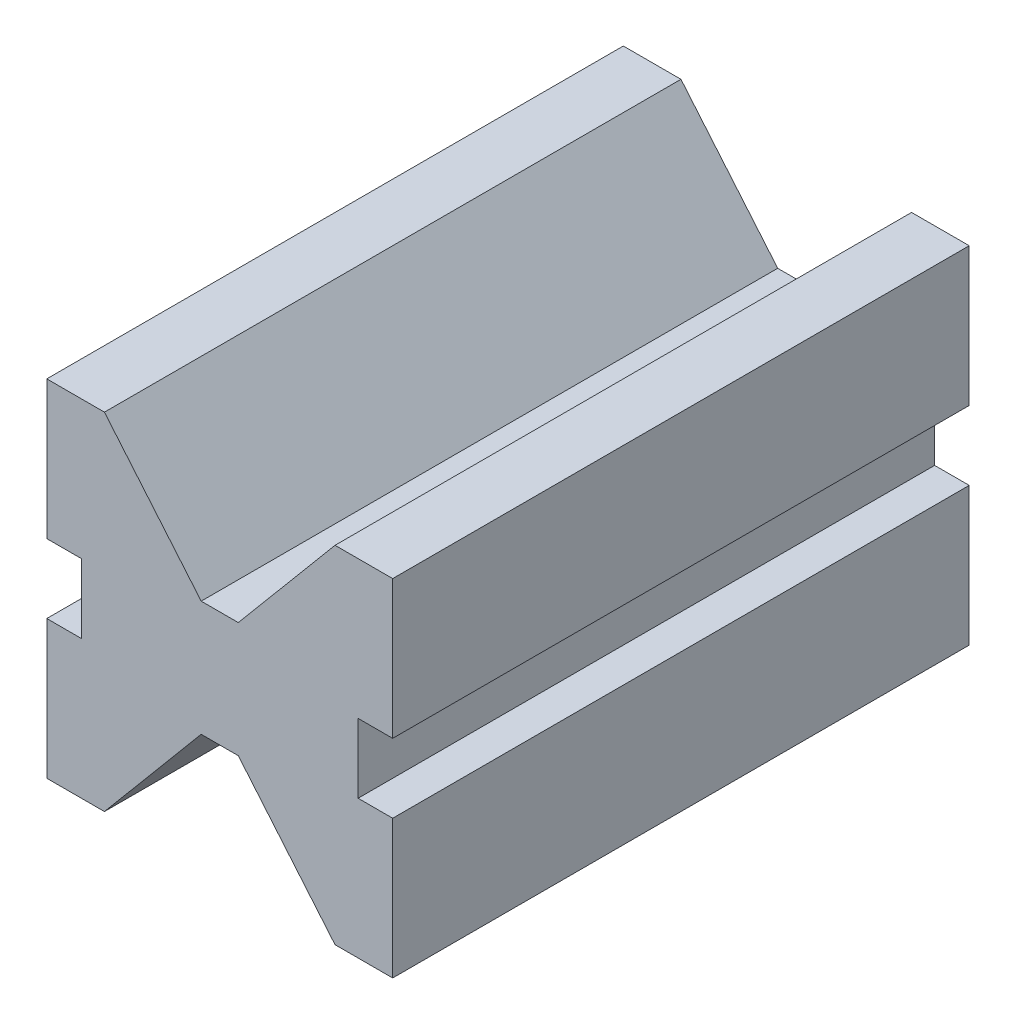
ISO-10303-21;
HEADER;
FILE_DESCRIPTION(('STEP AP214'),'2;1');
FILE_NAME('part.step','',(''),(''),'','','');
FILE_SCHEMA(('AUTOMOTIVE_DESIGN { 1 0 10303 214 1 1 1 1 }'));
ENDSEC;
DATA;
#1=APPLICATION_CONTEXT('core data for automotive mechanical design processes');
#2=APPLICATION_PROTOCOL_DEFINITION('international standard','automotive_design',2000,#1);
#3=PRODUCT_CONTEXT('',#1,'mechanical');
#4=PRODUCT('Part','Part','',(#3));
#5=PRODUCT_RELATED_PRODUCT_CATEGORY('part','',(#4));
#6=PRODUCT_DEFINITION_FORMATION('','',#4);
#7=PRODUCT_DEFINITION_CONTEXT('part definition',#1,'design');
#8=PRODUCT_DEFINITION('design','',#6,#7);
#9=PRODUCT_DEFINITION_SHAPE('','',#8);
#10=(LENGTH_UNIT() NAMED_UNIT(*) SI_UNIT(.MILLI.,.METRE.));
#11=(NAMED_UNIT(*) PLANE_ANGLE_UNIT() SI_UNIT($,.RADIAN.));
#12=(NAMED_UNIT(*) SI_UNIT($,.STERADIAN.) SOLID_ANGLE_UNIT());
#13=UNCERTAINTY_MEASURE_WITH_UNIT(LENGTH_MEASURE(1.E-05),#10,'distance_accuracy_value','');
#14=(GEOMETRIC_REPRESENTATION_CONTEXT(3) GLOBAL_UNCERTAINTY_ASSIGNED_CONTEXT((#13)) GLOBAL_UNIT_ASSIGNED_CONTEXT((#10,
#11,#12)) REPRESENTATION_CONTEXT('',''));
#15=CARTESIAN_POINT('',(0.,0.,0.));
#16=DIRECTION('',(0.,0.,1.));
#17=DIRECTION('',(1.,0.,0.));
#18=AXIS2_PLACEMENT_3D('',#15,#16,#17);
#19=CARTESIAN_POINT('',(0.,0.,100.));
#20=DIRECTION('',(0.,0.,1.));
#21=DIRECTION('',(1.,0.,0.));
#22=AXIS2_PLACEMENT_3D('',#19,#20,#21);
#23=PLANE('',#22);
#24=DIRECTION('',(0.,-1.,0.));
#25=VECTOR('',#24,1.);
#26=CARTESIAN_POINT('',(-30.,30.,100.));
#27=LINE('',#26,#25);
#28=CARTESIAN_POINT('',(-30.,30.,100.));
#29=VERTEX_POINT('',#28);
#30=CARTESIAN_POINT('',(-30.,6.,100.));
#31=VERTEX_POINT('',#30);
#32=EDGE_CURVE('E280',#29,#31,#27,.T.);
#33=ORIENTED_EDGE('',*,*,#32,.T.);
#34=DIRECTION('',(1.,0.,0.));
#35=VECTOR('',#34,1.);
#36=CARTESIAN_POINT('',(-24.,6.,100.));
#37=LINE('',#36,#35);
#38=CARTESIAN_POINT('',(-24.,6.,100.));
#39=VERTEX_POINT('',#38);
#40=EDGE_CURVE('E189',#31,#39,#37,.T.);
#41=ORIENTED_EDGE('',*,*,#40,.T.);
#42=DIRECTION('',(0.,-1.,0.));
#43=VECTOR('',#42,1.);
#44=CARTESIAN_POINT('',(-24.,6.,100.));
#45=LINE('',#44,#43);
#46=CARTESIAN_POINT('',(-24.,-6.,100.));
#47=VERTEX_POINT('',#46);
#48=EDGE_CURVE('E192',#39,#47,#45,.T.);
#49=ORIENTED_EDGE('',*,*,#48,.T.);
#50=DIRECTION('',(-1.,0.,0.));
#51=VECTOR('',#50,1.);
#52=CARTESIAN_POINT('',(-24.,-6.,100.));
#53=LINE('',#52,#51);
#54=CARTESIAN_POINT('',(-30.,-6.,100.));
#55=VERTEX_POINT('',#54);
#56=EDGE_CURVE('E182',#47,#55,#53,.T.);
#57=ORIENTED_EDGE('',*,*,#56,.T.);
#58=CARTESIAN_POINT('',(-30.,-30.,100.));
#59=VERTEX_POINT('',#58);
#60=EDGE_CURVE('E279',#55,#59,#27,.T.);
#61=ORIENTED_EDGE('',*,*,#60,.T.);
#62=DIRECTION('',(1.,0.,0.));
#63=VECTOR('',#62,1.);
#64=CARTESIAN_POINT('',(-30.,-30.,100.));
#65=LINE('',#64,#63);
#66=CARTESIAN_POINT('',(-20.,-30.,100.));
#67=VERTEX_POINT('',#66);
#68=EDGE_CURVE('E284',#59,#67,#65,.T.);
#69=ORIENTED_EDGE('',*,*,#68,.T.);
#70=DIRECTION('',(0.642787609686538,0.766044443118979,0.));
#71=VECTOR('',#70,1.);
#72=CARTESIAN_POINT('',(-20.,-30.,100.));
#73=LINE('',#72,#71);
#74=CARTESIAN_POINT('',(-3.21800737645445,-10.,100.));
#75=VERTEX_POINT('',#74);
#76=EDGE_CURVE('E249',#67,#75,#73,.T.);
#77=ORIENTED_EDGE('',*,*,#76,.T.);
#78=DIRECTION('',(1.,0.,0.));
#79=VECTOR('',#78,1.);
#80=CARTESIAN_POINT('',(-3.21800737645445,-10.,100.));
#81=LINE('',#80,#79);
#82=CARTESIAN_POINT('',(3.21800737645445,-10.,100.));
#83=VERTEX_POINT('',#82);
#84=EDGE_CURVE('E245',#75,#83,#81,.T.);
#85=ORIENTED_EDGE('',*,*,#84,.T.);
#86=DIRECTION('',(0.642787609686538,-0.766044443118979,0.));
#87=VECTOR('',#86,1.);
#88=CARTESIAN_POINT('',(20.,-30.,100.));
#89=LINE('',#88,#87);
#90=CARTESIAN_POINT('',(20.,-30.,100.));
#91=VERTEX_POINT('',#90);
#92=EDGE_CURVE('E248',#83,#91,#89,.T.);
#93=ORIENTED_EDGE('',*,*,#92,.T.);
#94=CARTESIAN_POINT('',(30.,-30.,100.));
#95=VERTEX_POINT('',#94);
#96=EDGE_CURVE('E283',#91,#95,#65,.T.);
#97=ORIENTED_EDGE('',*,*,#96,.T.);
#98=DIRECTION('',(0.,1.,0.));
#99=VECTOR('',#98,1.);
#100=CARTESIAN_POINT('',(30.,30.,100.));
#101=LINE('',#100,#99);
#102=CARTESIAN_POINT('',(30.,-6.,100.));
#103=VERTEX_POINT('',#102);
#104=EDGE_CURVE('E271',#95,#103,#101,.T.);
#105=ORIENTED_EDGE('',*,*,#104,.T.);
#106=DIRECTION('',(1.,0.,0.));
#107=VECTOR('',#106,1.);
#108=CARTESIAN_POINT('',(24.,-6.,100.));
#109=LINE('',#108,#107);
#110=CARTESIAN_POINT('',(24.,-6.,100.));
#111=VERTEX_POINT('',#110);
#112=EDGE_CURVE('E202',#111,#103,#109,.T.);
#113=ORIENTED_EDGE('',*,*,#112,.F.);
#114=DIRECTION('',(0.,-1.,0.));
#115=VECTOR('',#114,1.);
#116=CARTESIAN_POINT('',(24.,6.,100.));
#117=LINE('',#116,#115);
#118=CARTESIAN_POINT('',(24.,6.,100.));
#119=VERTEX_POINT('',#118);
#120=EDGE_CURVE('E210',#119,#111,#117,.T.);
#121=ORIENTED_EDGE('',*,*,#120,.F.);
#122=DIRECTION('',(-1.,0.,0.));
#123=VECTOR('',#122,1.);
#124=CARTESIAN_POINT('',(24.,6.,100.));
#125=LINE('',#124,#123);
#126=CARTESIAN_POINT('',(30.,6.,100.));
#127=VERTEX_POINT('',#126);
#128=EDGE_CURVE('E198',#127,#119,#125,.T.);
#129=ORIENTED_EDGE('',*,*,#128,.F.);
#130=CARTESIAN_POINT('',(30.,30.,100.));
#131=VERTEX_POINT('',#130);
#132=EDGE_CURVE('E275',#127,#131,#101,.T.);
#133=ORIENTED_EDGE('',*,*,#132,.T.);
#134=DIRECTION('',(-1.,0.,0.));
#135=VECTOR('',#134,1.);
#136=CARTESIAN_POINT('',(-30.,30.,100.));
#137=LINE('',#136,#135);
#138=CARTESIAN_POINT('',(20.,30.,100.));
#139=VERTEX_POINT('',#138);
#140=EDGE_CURVE('E276',#131,#139,#137,.T.);
#141=ORIENTED_EDGE('',*,*,#140,.T.);
#142=DIRECTION('',(0.642787609686538,0.766044443118979,0.));
#143=VECTOR('',#142,1.);
#144=CARTESIAN_POINT('',(20.,30.,100.));
#145=LINE('',#144,#143);
#146=CARTESIAN_POINT('',(3.21800737645445,10.,100.));
#147=VERTEX_POINT('',#146);
#148=EDGE_CURVE('E222',#147,#139,#145,.T.);
#149=ORIENTED_EDGE('',*,*,#148,.F.);
#150=DIRECTION('',(1.,0.,0.));
#151=VECTOR('',#150,1.);
#152=CARTESIAN_POINT('',(-3.21800737645445,10.,100.));
#153=LINE('',#152,#151);
#154=CARTESIAN_POINT('',(-3.21800737645445,10.,100.));
#155=VERTEX_POINT('',#154);
#156=EDGE_CURVE('E219',#155,#147,#153,.T.);
#157=ORIENTED_EDGE('',*,*,#156,.F.);
#158=DIRECTION('',(0.642787609686538,-0.766044443118979,0.));
#159=VECTOR('',#158,1.);
#160=CARTESIAN_POINT('',(-20.,30.,100.));
#161=LINE('',#160,#159);
#162=CARTESIAN_POINT('',(-20.,30.,100.));
#163=VERTEX_POINT('',#162);
#164=EDGE_CURVE('E223',#163,#155,#161,.T.);
#165=ORIENTED_EDGE('',*,*,#164,.F.);
#166=EDGE_CURVE('E274',#163,#29,#137,.T.);
#167=ORIENTED_EDGE('',*,*,#166,.T.);
#168=EDGE_LOOP('',(#33,#41,#49,#57,#61,#69,#77,#85,#93,#97,#105,#113,#121,#129,#133,#141,#149,
#157,#165,#167));
#169=FACE_BOUND('',#168,.T.);
#170=ADVANCED_FACE('F33',(#169),#23,.T.);
#171=CARTESIAN_POINT('',(0.,0.,0.));
#172=DIRECTION('',(0.,0.,1.));
#173=DIRECTION('',(1.,0.,0.));
#174=AXIS2_PLACEMENT_3D('',#171,#172,#173);
#175=PLANE('',#174);
#176=DIRECTION('',(1.,0.,0.));
#177=VECTOR('',#176,1.);
#178=CARTESIAN_POINT('',(-24.,6.,0.));
#179=LINE('',#178,#177);
#180=CARTESIAN_POINT('',(-30.,6.,0.));
#181=VERTEX_POINT('',#180);
#182=CARTESIAN_POINT('',(-24.,6.,0.));
#183=VERTEX_POINT('',#182);
#184=EDGE_CURVE('E178',#181,#183,#179,.T.);
#185=ORIENTED_EDGE('',*,*,#184,.F.);
#186=DIRECTION('',(0.,-1.,0.));
#187=VECTOR('',#186,1.);
#188=CARTESIAN_POINT('',(-30.,30.,0.));
#189=LINE('',#188,#187);
#190=CARTESIAN_POINT('',(-30.,30.,0.));
#191=VERTEX_POINT('',#190);
#192=EDGE_CURVE('E295',#191,#181,#189,.T.);
#193=ORIENTED_EDGE('',*,*,#192,.F.);
#194=DIRECTION('',(-1.,0.,0.));
#195=VECTOR('',#194,1.);
#196=CARTESIAN_POINT('',(-30.,30.,0.));
#197=LINE('',#196,#195);
#198=CARTESIAN_POINT('',(-20.,30.,0.));
#199=VERTEX_POINT('',#198);
#200=EDGE_CURVE('E291',#199,#191,#197,.T.);
#201=ORIENTED_EDGE('',*,*,#200,.F.);
#202=DIRECTION('',(0.642787609686538,-0.766044443118979,0.));
#203=VECTOR('',#202,1.);
#204=CARTESIAN_POINT('',(-20.,30.,0.));
#205=LINE('',#204,#203);
#206=CARTESIAN_POINT('',(-3.21800737645445,10.,0.));
#207=VERTEX_POINT('',#206);
#208=EDGE_CURVE('E230',#199,#207,#205,.T.);
#209=ORIENTED_EDGE('',*,*,#208,.T.);
#210=DIRECTION('',(1.,0.,0.));
#211=VECTOR('',#210,1.);
#212=CARTESIAN_POINT('',(-3.21800737645445,10.,0.));
#213=LINE('',#212,#211);
#214=CARTESIAN_POINT('',(3.21800737645445,10.,0.));
#215=VERTEX_POINT('',#214);
#216=EDGE_CURVE('E228',#207,#215,#213,.T.);
#217=ORIENTED_EDGE('',*,*,#216,.T.);
#218=DIRECTION('',(0.642787609686538,0.766044443118979,0.));
#219=VECTOR('',#218,1.);
#220=CARTESIAN_POINT('',(20.,30.,0.));
#221=LINE('',#220,#219);
#222=CARTESIAN_POINT('',(20.,30.,0.));
#223=VERTEX_POINT('',#222);
#224=EDGE_CURVE('E216',#215,#223,#221,.T.);
#225=ORIENTED_EDGE('',*,*,#224,.T.);
#226=CARTESIAN_POINT('',(30.,30.,0.));
#227=VERTEX_POINT('',#226);
#228=EDGE_CURVE('E292',#227,#223,#197,.T.);
#229=ORIENTED_EDGE('',*,*,#228,.F.);
#230=DIRECTION('',(0.,1.,0.));
#231=VECTOR('',#230,1.);
#232=CARTESIAN_POINT('',(30.,30.,0.));
#233=LINE('',#232,#231);
#234=CARTESIAN_POINT('',(30.,6.,0.));
#235=VERTEX_POINT('',#234);
#236=EDGE_CURVE('E252',#235,#227,#233,.T.);
#237=ORIENTED_EDGE('',*,*,#236,.F.);
#238=DIRECTION('',(-1.,0.,0.));
#239=VECTOR('',#238,1.);
#240=CARTESIAN_POINT('',(24.,6.,0.));
#241=LINE('',#240,#239);
#242=CARTESIAN_POINT('',(24.,6.,0.));
#243=VERTEX_POINT('',#242);
#244=EDGE_CURVE('E56',#235,#243,#241,.T.);
#245=ORIENTED_EDGE('',*,*,#244,.T.);
#246=DIRECTION('',(0.,-1.,0.));
#247=VECTOR('',#246,1.);
#248=CARTESIAN_POINT('',(24.,6.,0.));
#249=LINE('',#248,#247);
#250=CARTESIAN_POINT('',(24.,-6.,0.));
#251=VERTEX_POINT('',#250);
#252=EDGE_CURVE('E201',#243,#251,#249,.T.);
#253=ORIENTED_EDGE('',*,*,#252,.T.);
#254=DIRECTION('',(1.,0.,0.));
#255=VECTOR('',#254,1.);
#256=CARTESIAN_POINT('',(24.,-6.,0.));
#257=LINE('',#256,#255);
#258=CARTESIAN_POINT('',(30.,-6.,0.));
#259=VERTEX_POINT('',#258);
#260=EDGE_CURVE('E205',#251,#259,#257,.T.);
#261=ORIENTED_EDGE('',*,*,#260,.T.);
#262=CARTESIAN_POINT('',(30.,-30.,0.));
#263=VERTEX_POINT('',#262);
#264=EDGE_CURVE('E288',#263,#259,#233,.T.);
#265=ORIENTED_EDGE('',*,*,#264,.F.);
#266=DIRECTION('',(1.,0.,0.));
#267=VECTOR('',#266,1.);
#268=CARTESIAN_POINT('',(-30.,-30.,0.));
#269=LINE('',#268,#267);
#270=CARTESIAN_POINT('',(20.,-30.,0.));
#271=VERTEX_POINT('',#270);
#272=EDGE_CURVE('E298',#271,#263,#269,.T.);
#273=ORIENTED_EDGE('',*,*,#272,.F.);
#274=DIRECTION('',(0.642787609686538,-0.766044443118979,0.));
#275=VECTOR('',#274,1.);
#276=CARTESIAN_POINT('',(20.,-30.,0.));
#277=LINE('',#276,#275);
#278=CARTESIAN_POINT('',(3.21800737645445,-10.,0.));
#279=VERTEX_POINT('',#278);
#280=EDGE_CURVE('E226',#279,#271,#277,.T.);
#281=ORIENTED_EDGE('',*,*,#280,.F.);
#282=DIRECTION('',(1.,0.,0.));
#283=VECTOR('',#282,1.);
#284=CARTESIAN_POINT('',(-3.21800737645445,-10.,0.));
#285=LINE('',#284,#283);
#286=CARTESIAN_POINT('',(-3.21800737645445,-10.,0.));
#287=VERTEX_POINT('',#286);
#288=EDGE_CURVE('E254',#287,#279,#285,.T.);
#289=ORIENTED_EDGE('',*,*,#288,.F.);
#290=DIRECTION('',(0.642787609686538,0.766044443118979,0.));
#291=VECTOR('',#290,1.);
#292=CARTESIAN_POINT('',(-20.,-30.,0.));
#293=LINE('',#292,#291);
#294=CARTESIAN_POINT('',(-20.,-30.,0.));
#295=VERTEX_POINT('',#294);
#296=EDGE_CURVE('E257',#295,#287,#293,.T.);
#297=ORIENTED_EDGE('',*,*,#296,.F.);
#298=CARTESIAN_POINT('',(-30.,-30.,0.));
#299=VERTEX_POINT('',#298);
#300=EDGE_CURVE('E299',#299,#295,#269,.T.);
#301=ORIENTED_EDGE('',*,*,#300,.F.);
#302=CARTESIAN_POINT('',(-30.,-6.,0.));
#303=VERTEX_POINT('',#302);
#304=EDGE_CURVE('E188',#303,#299,#189,.T.);
#305=ORIENTED_EDGE('',*,*,#304,.F.);
#306=DIRECTION('',(-1.,0.,0.));
#307=VECTOR('',#306,1.);
#308=CARTESIAN_POINT('',(-24.,-6.,0.));
#309=LINE('',#308,#307);
#310=CARTESIAN_POINT('',(-24.,-6.,0.));
#311=VERTEX_POINT('',#310);
#312=EDGE_CURVE('E48',#311,#303,#309,.T.);
#313=ORIENTED_EDGE('',*,*,#312,.F.);
#314=DIRECTION('',(0.,-1.,0.));
#315=VECTOR('',#314,1.);
#316=CARTESIAN_POINT('',(-24.,6.,0.));
#317=LINE('',#316,#315);
#318=EDGE_CURVE('E170',#183,#311,#317,.T.);
#319=ORIENTED_EDGE('',*,*,#318,.F.);
#320=EDGE_LOOP('',(#185,#193,#201,#209,#217,#225,#229,#237,#245,#253,#261,#265,#273,#281,#289,
#297,#301,#305,#313,#319));
#321=FACE_BOUND('',#320,.T.);
#322=ADVANCED_FACE('F186',(#321),#175,.F.);
#323=CARTESIAN_POINT('',(-30.,30.,100.));
#324=DIRECTION('',(1.,0.,0.));
#325=DIRECTION('',(0.,0.,-1.));
#326=AXIS2_PLACEMENT_3D('',#323,#324,#325);
#327=PLANE('',#326);
#328=DIRECTION('',(0.,0.,-1.));
#329=VECTOR('',#328,1.);
#330=CARTESIAN_POINT('',(-30.,6.,100.));
#331=LINE('',#330,#329);
#332=EDGE_CURVE('E11',#31,#181,#331,.T.);
#333=ORIENTED_EDGE('',*,*,#332,.F.);
#334=ORIENTED_EDGE('',*,*,#32,.F.);
#335=DIRECTION('',(0.,0.,-1.));
#336=VECTOR('',#335,1.);
#337=CARTESIAN_POINT('',(-30.,30.,100.));
#338=LINE('',#337,#336);
#339=EDGE_CURVE('E307',#29,#191,#338,.T.);
#340=ORIENTED_EDGE('',*,*,#339,.T.);
#341=ORIENTED_EDGE('',*,*,#192,.T.);
#342=EDGE_LOOP('',(#333,#334,#340,#341));
#343=FACE_BOUND('',#342,.T.);
#344=ADVANCED_FACE('F383',(#343),#327,.F.);
#345=DIRECTION('',(0.,0.,1.));
#346=VECTOR('',#345,1.);
#347=CARTESIAN_POINT('',(-30.,-6.,100.));
#348=LINE('',#347,#346);
#349=EDGE_CURVE('E41',#303,#55,#348,.T.);
#350=ORIENTED_EDGE('',*,*,#349,.F.);
#351=ORIENTED_EDGE('',*,*,#304,.T.);
#352=DIRECTION('',(0.,0.,-1.));
#353=VECTOR('',#352,1.);
#354=CARTESIAN_POINT('',(-30.,-30.,100.));
#355=LINE('',#354,#353);
#356=EDGE_CURVE('E304',#59,#299,#355,.T.);
#357=ORIENTED_EDGE('',*,*,#356,.F.);
#358=ORIENTED_EDGE('',*,*,#60,.F.);
#359=EDGE_LOOP('',(#350,#351,#357,#358));
#360=FACE_BOUND('',#359,.T.);
#361=ADVANCED_FACE('F321',(#360),#327,.F.);
#362=CARTESIAN_POINT('',(30.,30.,100.));
#363=DIRECTION('',(-1.,0.,0.));
#364=DIRECTION('',(0.,0.,1.));
#365=AXIS2_PLACEMENT_3D('',#362,#363,#364);
#366=PLANE('',#365);
#367=ORIENTED_EDGE('',*,*,#264,.T.);
#368=DIRECTION('',(0.,0.,1.));
#369=VECTOR('',#368,1.);
#370=CARTESIAN_POINT('',(30.,-6.,100.));
#371=LINE('',#370,#369);
#372=EDGE_CURVE('E315',#259,#103,#371,.T.);
#373=ORIENTED_EDGE('',*,*,#372,.T.);
#374=ORIENTED_EDGE('',*,*,#104,.F.);
#375=DIRECTION('',(0.,0.,-1.));
#376=VECTOR('',#375,1.);
#377=CARTESIAN_POINT('',(30.,-30.,100.));
#378=LINE('',#377,#376);
#379=EDGE_CURVE('E287',#95,#263,#378,.T.);
#380=ORIENTED_EDGE('',*,*,#379,.T.);
#381=EDGE_LOOP('',(#367,#373,#374,#380));
#382=FACE_BOUND('',#381,.T.);
#383=ADVANCED_FACE('F347',(#382),#366,.F.);
#384=CARTESIAN_POINT('',(-30.,30.,100.));
#385=DIRECTION('',(0.,-1.,0.));
#386=DIRECTION('',(0.,0.,-1.));
#387=AXIS2_PLACEMENT_3D('',#384,#385,#386);
#388=PLANE('',#387);
#389=DIRECTION('',(0.,0.,-1.));
#390=VECTOR('',#389,1.);
#391=CARTESIAN_POINT('',(20.,30.,263.93596310755));
#392=LINE('',#391,#390);
#393=EDGE_CURVE('E232',#139,#223,#392,.T.);
#394=ORIENTED_EDGE('',*,*,#393,.F.);
#395=ORIENTED_EDGE('',*,*,#140,.F.);
#396=DIRECTION('',(0.,0.,-1.));
#397=VECTOR('',#396,1.);
#398=CARTESIAN_POINT('',(30.,30.,100.));
#399=LINE('',#398,#397);
#400=EDGE_CURVE('E310',#131,#227,#399,.T.);
#401=ORIENTED_EDGE('',*,*,#400,.T.);
#402=ORIENTED_EDGE('',*,*,#228,.T.);
#403=EDGE_LOOP('',(#394,#395,#401,#402));
#404=FACE_BOUND('',#403,.T.);
#405=ADVANCED_FACE('F362',(#404),#388,.F.);
#406=CARTESIAN_POINT('',(-30.,-30.,100.));
#407=DIRECTION('',(0.,1.,0.));
#408=DIRECTION('',(0.,0.,1.));
#409=AXIS2_PLACEMENT_3D('',#406,#407,#408);
#410=PLANE('',#409);
#411=DIRECTION('',(0.,0.,-1.));
#412=VECTOR('',#411,1.);
#413=CARTESIAN_POINT('',(-20.,-30.,388.93596310755));
#414=LINE('',#413,#412);
#415=EDGE_CURVE('E267',#67,#295,#414,.T.);
#416=ORIENTED_EDGE('',*,*,#415,.F.);
#417=ORIENTED_EDGE('',*,*,#68,.F.);
#418=ORIENTED_EDGE('',*,*,#356,.T.);
#419=ORIENTED_EDGE('',*,*,#300,.T.);
#420=EDGE_LOOP('',(#416,#417,#418,#419));
#421=FACE_BOUND('',#420,.T.);
#422=ADVANCED_FACE('F325',(#421),#410,.F.);
#423=ORIENTED_EDGE('',*,*,#132,.F.);
#424=DIRECTION('',(0.,0.,-1.));
#425=VECTOR('',#424,1.);
#426=CARTESIAN_POINT('',(30.,6.,100.));
#427=LINE('',#426,#425);
#428=EDGE_CURVE('E313',#127,#235,#427,.T.);
#429=ORIENTED_EDGE('',*,*,#428,.T.);
#430=ORIENTED_EDGE('',*,*,#236,.T.);
#431=ORIENTED_EDGE('',*,*,#400,.F.);
#432=EDGE_LOOP('',(#423,#429,#430,#431));
#433=FACE_BOUND('',#432,.T.);
#434=ADVANCED_FACE('F35',(#433),#366,.F.);
#435=ORIENTED_EDGE('',*,*,#166,.F.);
#436=DIRECTION('',(0.,0.,-1.));
#437=VECTOR('',#436,1.);
#438=CARTESIAN_POINT('',(-20.,30.,263.93596310755));
#439=LINE('',#438,#437);
#440=EDGE_CURVE('E241',#163,#199,#439,.T.);
#441=ORIENTED_EDGE('',*,*,#440,.T.);
#442=ORIENTED_EDGE('',*,*,#200,.T.);
#443=ORIENTED_EDGE('',*,*,#339,.F.);
#444=EDGE_LOOP('',(#435,#441,#442,#443));
#445=FACE_BOUND('',#444,.T.);
#446=ADVANCED_FACE('F378',(#445),#388,.F.);
#447=ORIENTED_EDGE('',*,*,#96,.F.);
#448=DIRECTION('',(0.,0.,-1.));
#449=VECTOR('',#448,1.);
#450=CARTESIAN_POINT('',(20.,-30.,388.93596310755));
#451=LINE('',#450,#449);
#452=EDGE_CURVE('E259',#91,#271,#451,.T.);
#453=ORIENTED_EDGE('',*,*,#452,.T.);
#454=ORIENTED_EDGE('',*,*,#272,.T.);
#455=ORIENTED_EDGE('',*,*,#379,.F.);
#456=EDGE_LOOP('',(#447,#453,#454,#455));
#457=FACE_BOUND('',#456,.T.);
#458=ADVANCED_FACE('F341',(#457),#410,.F.);
#459=CARTESIAN_POINT('',(-20.,-30.,388.93596310755));
#460=DIRECTION('',(-0.766044443118979,0.642787609686538,0.));
#461=DIRECTION('',(-0.642787609686538,-0.766044443118979,0.));
#462=AXIS2_PLACEMENT_3D('',#459,#460,#461);
#463=PLANE('',#462);
#464=ORIENTED_EDGE('',*,*,#415,.T.);
#465=ORIENTED_EDGE('',*,*,#296,.T.);
#466=DIRECTION('',(0.,0.,-1.));
#467=VECTOR('',#466,1.);
#468=CARTESIAN_POINT('',(-3.21800737645445,-10.,388.93596310755));
#469=LINE('',#468,#467);
#470=EDGE_CURVE('E264',#75,#287,#469,.T.);
#471=ORIENTED_EDGE('',*,*,#470,.F.);
#472=ORIENTED_EDGE('',*,*,#76,.F.);
#473=EDGE_LOOP('',(#464,#465,#471,#472));
#474=FACE_BOUND('',#473,.T.);
#475=ADVANCED_FACE('F328',(#474),#463,.F.);
#476=CARTESIAN_POINT('',(-3.21800737645445,-10.,388.93596310755));
#477=DIRECTION('',(0.,1.,0.));
#478=DIRECTION('',(0.,0.,1.));
#479=AXIS2_PLACEMENT_3D('',#476,#477,#478);
#480=PLANE('',#479);
#481=ORIENTED_EDGE('',*,*,#470,.T.);
#482=ORIENTED_EDGE('',*,*,#288,.T.);
#483=DIRECTION('',(0.,0.,-1.));
#484=VECTOR('',#483,1.);
#485=CARTESIAN_POINT('',(3.21800737645445,-10.,388.93596310755));
#486=LINE('',#485,#484);
#487=EDGE_CURVE('E262',#83,#279,#486,.T.);
#488=ORIENTED_EDGE('',*,*,#487,.F.);
#489=ORIENTED_EDGE('',*,*,#84,.F.);
#490=EDGE_LOOP('',(#481,#482,#488,#489));
#491=FACE_BOUND('',#490,.T.);
#492=ADVANCED_FACE('F332',(#491),#480,.F.);
#493=CARTESIAN_POINT('',(20.,-30.,388.93596310755));
#494=DIRECTION('',(0.766044443118979,0.642787609686538,0.));
#495=DIRECTION('',(-0.642787609686538,0.766044443118979,0.));
#496=AXIS2_PLACEMENT_3D('',#493,#494,#495);
#497=PLANE('',#496);
#498=ORIENTED_EDGE('',*,*,#487,.T.);
#499=ORIENTED_EDGE('',*,*,#280,.T.);
#500=ORIENTED_EDGE('',*,*,#452,.F.);
#501=ORIENTED_EDGE('',*,*,#92,.F.);
#502=EDGE_LOOP('',(#498,#499,#500,#501));
#503=FACE_BOUND('',#502,.T.);
#504=ADVANCED_FACE('F338',(#503),#497,.F.);
#505=CARTESIAN_POINT('',(-20.,30.,263.93596310755));
#506=DIRECTION('',(0.766044443118979,0.642787609686538,0.));
#507=DIRECTION('',(-0.642787609686538,0.766044443118979,0.));
#508=AXIS2_PLACEMENT_3D('',#505,#506,#507);
#509=PLANE('',#508);
#510=ORIENTED_EDGE('',*,*,#440,.F.);
#511=ORIENTED_EDGE('',*,*,#164,.T.);
#512=DIRECTION('',(0.,0.,-1.));
#513=VECTOR('',#512,1.);
#514=CARTESIAN_POINT('',(-3.21800737645445,10.,263.93596310755));
#515=LINE('',#514,#513);
#516=EDGE_CURVE('E238',#155,#207,#515,.T.);
#517=ORIENTED_EDGE('',*,*,#516,.T.);
#518=ORIENTED_EDGE('',*,*,#208,.F.);
#519=EDGE_LOOP('',(#510,#511,#517,#518));
#520=FACE_BOUND('',#519,.T.);
#521=ADVANCED_FACE('F374',(#520),#509,.T.);
#522=CARTESIAN_POINT('',(-3.21800737645445,10.,263.93596310755));
#523=DIRECTION('',(0.,1.,0.));
#524=DIRECTION('',(0.,0.,1.));
#525=AXIS2_PLACEMENT_3D('',#522,#523,#524);
#526=PLANE('',#525);
#527=ORIENTED_EDGE('',*,*,#516,.F.);
#528=ORIENTED_EDGE('',*,*,#156,.T.);
#529=DIRECTION('',(0.,0.,-1.));
#530=VECTOR('',#529,1.);
#531=CARTESIAN_POINT('',(3.21800737645445,10.,263.93596310755));
#532=LINE('',#531,#530);
#533=EDGE_CURVE('E235',#147,#215,#532,.T.);
#534=ORIENTED_EDGE('',*,*,#533,.T.);
#535=ORIENTED_EDGE('',*,*,#216,.F.);
#536=EDGE_LOOP('',(#527,#528,#534,#535));
#537=FACE_BOUND('',#536,.T.);
#538=ADVANCED_FACE('F370',(#537),#526,.T.);
#539=CARTESIAN_POINT('',(20.,30.,263.93596310755));
#540=DIRECTION('',(-0.766044443118979,0.642787609686538,0.));
#541=DIRECTION('',(-0.642787609686538,-0.766044443118979,0.));
#542=AXIS2_PLACEMENT_3D('',#539,#540,#541);
#543=PLANE('',#542);
#544=ORIENTED_EDGE('',*,*,#533,.F.);
#545=ORIENTED_EDGE('',*,*,#148,.T.);
#546=ORIENTED_EDGE('',*,*,#393,.T.);
#547=ORIENTED_EDGE('',*,*,#224,.F.);
#548=EDGE_LOOP('',(#544,#545,#546,#547));
#549=FACE_BOUND('',#548,.T.);
#550=ADVANCED_FACE('F365',(#549),#543,.T.);
#551=CARTESIAN_POINT('',(24.,-6.,0.));
#552=DIRECTION('',(0.,-1.,0.));
#553=DIRECTION('',(0.,0.,-1.));
#554=AXIS2_PLACEMENT_3D('',#551,#552,#553);
#555=PLANE('',#554);
#556=ORIENTED_EDGE('',*,*,#260,.F.);
#557=DIRECTION('',(0.,0.,1.));
#558=VECTOR('',#557,1.);
#559=CARTESIAN_POINT('',(24.,-6.,0.));
#560=LINE('',#559,#558);
#561=EDGE_CURVE('E214',#251,#111,#560,.T.);
#562=ORIENTED_EDGE('',*,*,#561,.T.);
#563=ORIENTED_EDGE('',*,*,#112,.T.);
#564=ORIENTED_EDGE('',*,*,#372,.F.);
#565=EDGE_LOOP('',(#556,#562,#563,#564));
#566=FACE_BOUND('',#565,.T.);
#567=ADVANCED_FACE('F350',(#566),#555,.F.);
#568=CARTESIAN_POINT('',(24.,6.,0.));
#569=DIRECTION('',(0.,1.,0.));
#570=DIRECTION('',(0.,0.,1.));
#571=AXIS2_PLACEMENT_3D('',#568,#569,#570);
#572=PLANE('',#571);
#573=ORIENTED_EDGE('',*,*,#128,.T.);
#574=DIRECTION('',(0.,0.,1.));
#575=VECTOR('',#574,1.);
#576=CARTESIAN_POINT('',(24.,6.,0.));
#577=LINE('',#576,#575);
#578=EDGE_CURVE('E208',#243,#119,#577,.T.);
#579=ORIENTED_EDGE('',*,*,#578,.F.);
#580=ORIENTED_EDGE('',*,*,#244,.F.);
#581=ORIENTED_EDGE('',*,*,#428,.F.);
#582=EDGE_LOOP('',(#573,#579,#580,#581));
#583=FACE_BOUND('',#582,.T.);
#584=ADVANCED_FACE('F394',(#583),#572,.F.);
#585=CARTESIAN_POINT('',(24.,6.,0.));
#586=DIRECTION('',(-1.,0.,0.));
#587=DIRECTION('',(0.,0.,1.));
#588=AXIS2_PLACEMENT_3D('',#585,#586,#587);
#589=PLANE('',#588);
#590=ORIENTED_EDGE('',*,*,#120,.T.);
#591=ORIENTED_EDGE('',*,*,#561,.F.);
#592=ORIENTED_EDGE('',*,*,#252,.F.);
#593=ORIENTED_EDGE('',*,*,#578,.T.);
#594=EDGE_LOOP('',(#590,#591,#592,#593));
#595=FACE_BOUND('',#594,.T.);
#596=ADVANCED_FACE('F354',(#595),#589,.F.);
#597=CARTESIAN_POINT('',(-24.,6.,0.));
#598=DIRECTION('',(0.,-1.,0.));
#599=DIRECTION('',(0.,0.,-1.));
#600=AXIS2_PLACEMENT_3D('',#597,#598,#599);
#601=PLANE('',#600);
#602=ORIENTED_EDGE('',*,*,#332,.T.);
#603=ORIENTED_EDGE('',*,*,#184,.T.);
#604=DIRECTION('',(0.,0.,1.));
#605=VECTOR('',#604,1.);
#606=CARTESIAN_POINT('',(-24.,6.,0.));
#607=LINE('',#606,#605);
#608=EDGE_CURVE('E175',#183,#39,#607,.T.);
#609=ORIENTED_EDGE('',*,*,#608,.T.);
#610=ORIENTED_EDGE('',*,*,#40,.F.);
#611=EDGE_LOOP('',(#602,#603,#609,#610));
#612=FACE_BOUND('',#611,.T.);
#613=ADVANCED_FACE('F386',(#612),#601,.T.);
#614=CARTESIAN_POINT('',(-24.,-6.,0.));
#615=DIRECTION('',(0.,1.,0.));
#616=DIRECTION('',(0.,0.,1.));
#617=AXIS2_PLACEMENT_3D('',#614,#615,#616);
#618=PLANE('',#617);
#619=ORIENTED_EDGE('',*,*,#349,.T.);
#620=ORIENTED_EDGE('',*,*,#56,.F.);
#621=DIRECTION('',(0.,0.,1.));
#622=VECTOR('',#621,1.);
#623=CARTESIAN_POINT('',(-24.,-6.,0.));
#624=LINE('',#623,#622);
#625=EDGE_CURVE('E173',#311,#47,#624,.T.);
#626=ORIENTED_EDGE('',*,*,#625,.F.);
#627=ORIENTED_EDGE('',*,*,#312,.T.);
#628=EDGE_LOOP('',(#619,#620,#626,#627));
#629=FACE_BOUND('',#628,.T.);
#630=ADVANCED_FACE('F180',(#629),#618,.T.);
#631=CARTESIAN_POINT('',(-24.,6.,0.));
#632=DIRECTION('',(-1.,0.,0.));
#633=DIRECTION('',(0.,0.,1.));
#634=AXIS2_PLACEMENT_3D('',#631,#632,#633);
#635=PLANE('',#634);
#636=ORIENTED_EDGE('',*,*,#48,.F.);
#637=ORIENTED_EDGE('',*,*,#608,.F.);
#638=ORIENTED_EDGE('',*,*,#318,.T.);
#639=ORIENTED_EDGE('',*,*,#625,.T.);
#640=EDGE_LOOP('',(#636,#637,#638,#639));
#641=FACE_BOUND('',#640,.T.);
#642=ADVANCED_FACE('F172',(#641),#635,.T.);
#643=CLOSED_SHELL('',(#170,#322,#344,#361,#383,#405,#422,#434,#446,#458,#475,#492,#504,#521,
#538,#550,#567,#584,#596,#613,#630,#642));
#644=MANIFOLD_SOLID_BREP('B2',#643);
#645=ADVANCED_BREP_SHAPE_REPRESENTATION('',(#18,#644),#14);
#646=SHAPE_DEFINITION_REPRESENTATION(#9,#645);
ENDSEC;
END-ISO-10303-21;
